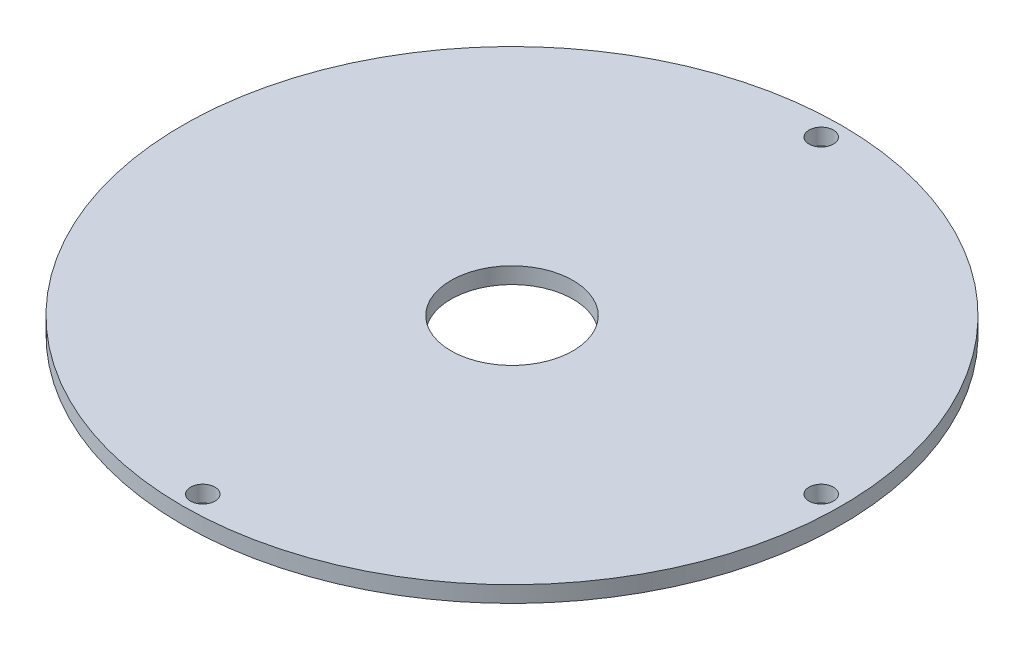
ISO-10303-21;
HEADER;
FILE_DESCRIPTION(('STEP AP214'),'2;1');
FILE_NAME('part.step','',(''),(''),'','','');
FILE_SCHEMA(('AUTOMOTIVE_DESIGN { 1 0 10303 214 1 1 1 1 }'));
ENDSEC;
DATA;
#1=APPLICATION_CONTEXT('core data for automotive mechanical design processes');
#2=APPLICATION_PROTOCOL_DEFINITION('international standard','automotive_design',2000,#1);
#3=PRODUCT_CONTEXT('',#1,'mechanical');
#4=PRODUCT('Part','Part','',(#3));
#5=PRODUCT_RELATED_PRODUCT_CATEGORY('part','',(#4));
#6=PRODUCT_DEFINITION_FORMATION('','',#4);
#7=PRODUCT_DEFINITION_CONTEXT('part definition',#1,'design');
#8=PRODUCT_DEFINITION('design','',#6,#7);
#9=PRODUCT_DEFINITION_SHAPE('','',#8);
#10=(LENGTH_UNIT() NAMED_UNIT(*) SI_UNIT(.MILLI.,.METRE.));
#11=(NAMED_UNIT(*) PLANE_ANGLE_UNIT() SI_UNIT($,.RADIAN.));
#12=(NAMED_UNIT(*) SI_UNIT($,.STERADIAN.) SOLID_ANGLE_UNIT());
#13=UNCERTAINTY_MEASURE_WITH_UNIT(LENGTH_MEASURE(1.E-05),#10,'distance_accuracy_value','');
#14=(GEOMETRIC_REPRESENTATION_CONTEXT(3) GLOBAL_UNCERTAINTY_ASSIGNED_CONTEXT((#13)) GLOBAL_UNIT_ASSIGNED_CONTEXT((#10,
#11,#12)) REPRESENTATION_CONTEXT('',''));
#15=CARTESIAN_POINT('',(0.,0.,0.));
#16=DIRECTION('',(0.,0.,1.));
#17=DIRECTION('',(1.,0.,0.));
#18=AXIS2_PLACEMENT_3D('',#15,#16,#17);
#19=CARTESIAN_POINT('',(0.,2.,0.));
#20=DIRECTION('',(0.,-1.,0.));
#21=DIRECTION('',(0.,0.,-1.));
#22=AXIS2_PLACEMENT_3D('',#19,#20,#21);
#23=CYLINDRICAL_SURFACE('',#22,40.5);
#24=CARTESIAN_POINT('',(0.,2.,0.));
#25=DIRECTION('',(0.,1.,0.));
#26=DIRECTION('',(0.,0.,1.));
#27=AXIS2_PLACEMENT_3D('',#24,#25,#26);
#28=CIRCLE('',#27,40.5);
#29=CARTESIAN_POINT('',(0.,2.,40.5));
#30=VERTEX_POINT('',#29);
#31=EDGE_CURVE('E10',#30,#30,#28,.T.);
#32=ORIENTED_EDGE('',*,*,#31,.F.);
#33=EDGE_LOOP('',(#32));
#34=FACE_BOUND('',#33,.T.);
#35=CARTESIAN_POINT('',(0.,0.,0.));
#36=DIRECTION('',(0.,1.,0.));
#37=DIRECTION('',(0.,0.,1.));
#38=AXIS2_PLACEMENT_3D('',#35,#36,#37);
#39=CIRCLE('',#38,40.5);
#40=CARTESIAN_POINT('',(0.,0.,40.5));
#41=VERTEX_POINT('',#40);
#42=EDGE_CURVE('E35',#41,#41,#39,.T.);
#43=ORIENTED_EDGE('',*,*,#42,.T.);
#44=EDGE_LOOP('',(#43));
#45=FACE_BOUND('',#44,.T.);
#46=ADVANCED_FACE('F32',(#34,#45),#23,.T.);
#47=CARTESIAN_POINT('',(0.,2.,0.));
#48=DIRECTION('',(0.,1.,0.));
#49=DIRECTION('',(0.,0.,1.));
#50=AXIS2_PLACEMENT_3D('',#47,#48,#49);
#51=PLANE('',#50);
#52=CARTESIAN_POINT('',(0.,2.,0.));
#53=DIRECTION('',(0.,1.,0.));
#54=DIRECTION('',(0.,0.,1.));
#55=AXIS2_PLACEMENT_3D('',#52,#53,#54);
#56=CIRCLE('',#55,7.5);
#57=CARTESIAN_POINT('',(0.,2.,7.5));
#58=VERTEX_POINT('',#57);
#59=EDGE_CURVE('E62',#58,#58,#56,.T.);
#60=ORIENTED_EDGE('',*,*,#59,.F.);
#61=EDGE_LOOP('',(#60));
#62=FACE_BOUND('',#61,.T.);
#63=CARTESIAN_POINT('',(0.,2.,-38.));
#64=DIRECTION('',(0.,1.,0.));
#65=DIRECTION('',(0.,0.,1.));
#66=AXIS2_PLACEMENT_3D('',#63,#64,#65);
#67=CIRCLE('',#66,1.5);
#68=CARTESIAN_POINT('',(0.,2.,-36.5));
#69=VERTEX_POINT('',#68);
#70=EDGE_CURVE('E57',#69,#69,#67,.T.);
#71=ORIENTED_EDGE('',*,*,#70,.F.);
#72=EDGE_LOOP('',(#71));
#73=FACE_BOUND('',#72,.T.);
#74=CARTESIAN_POINT('',(38.,2.,0.));
#75=DIRECTION('',(0.,1.,0.));
#76=DIRECTION('',(0.,0.,1.));
#77=AXIS2_PLACEMENT_3D('',#74,#75,#76);
#78=CIRCLE('',#77,1.5);
#79=CARTESIAN_POINT('',(38.,2.,1.5));
#80=VERTEX_POINT('',#79);
#81=EDGE_CURVE('E51',#80,#80,#78,.T.);
#82=ORIENTED_EDGE('',*,*,#81,.F.);
#83=EDGE_LOOP('',(#82));
#84=FACE_BOUND('',#83,.T.);
#85=CARTESIAN_POINT('',(0.,2.,38.));
#86=DIRECTION('',(0.,1.,0.));
#87=DIRECTION('',(0.,0.,1.));
#88=AXIS2_PLACEMENT_3D('',#85,#86,#87);
#89=CIRCLE('',#88,1.5);
#90=CARTESIAN_POINT('',(0.,2.,39.5));
#91=VERTEX_POINT('',#90);
#92=EDGE_CURVE('E44',#91,#91,#89,.T.);
#93=ORIENTED_EDGE('',*,*,#92,.F.);
#94=EDGE_LOOP('',(#93));
#95=FACE_BOUND('',#94,.T.);
#96=ORIENTED_EDGE('',*,*,#31,.T.);
#97=EDGE_LOOP('',(#96));
#98=FACE_BOUND('',#97,.T.);
#99=ADVANCED_FACE('F78',(#62,#73,#84,#95,#98),#51,.T.);
#100=CARTESIAN_POINT('',(0.,0.,0.));
#101=DIRECTION('',(0.,1.,0.));
#102=DIRECTION('',(0.,0.,1.));
#103=AXIS2_PLACEMENT_3D('',#100,#101,#102);
#104=PLANE('',#103);
#105=CARTESIAN_POINT('',(0.,0.,0.));
#106=DIRECTION('',(0.,1.,0.));
#107=DIRECTION('',(0.,0.,1.));
#108=AXIS2_PLACEMENT_3D('',#105,#106,#107);
#109=CIRCLE('',#108,7.5);
#110=CARTESIAN_POINT('',(0.,0.,7.5));
#111=VERTEX_POINT('',#110);
#112=EDGE_CURVE('E48',#111,#111,#109,.T.);
#113=ORIENTED_EDGE('',*,*,#112,.T.);
#114=EDGE_LOOP('',(#113));
#115=FACE_BOUND('',#114,.T.);
#116=CARTESIAN_POINT('',(0.,0.,-38.));
#117=DIRECTION('',(0.,1.,0.));
#118=DIRECTION('',(0.,0.,1.));
#119=AXIS2_PLACEMENT_3D('',#116,#117,#118);
#120=CIRCLE('',#119,1.5);
#121=CARTESIAN_POINT('',(0.,0.,-36.5));
#122=VERTEX_POINT('',#121);
#123=EDGE_CURVE('E42',#122,#122,#120,.T.);
#124=ORIENTED_EDGE('',*,*,#123,.T.);
#125=EDGE_LOOP('',(#124));
#126=FACE_BOUND('',#125,.T.);
#127=CARTESIAN_POINT('',(38.,0.,0.));
#128=DIRECTION('',(0.,1.,0.));
#129=DIRECTION('',(0.,0.,1.));
#130=AXIS2_PLACEMENT_3D('',#127,#128,#129);
#131=CIRCLE('',#130,1.5);
#132=CARTESIAN_POINT('',(38.,0.,1.5));
#133=VERTEX_POINT('',#132);
#134=EDGE_CURVE('E54',#133,#133,#131,.T.);
#135=ORIENTED_EDGE('',*,*,#134,.T.);
#136=EDGE_LOOP('',(#135));
#137=FACE_BOUND('',#136,.T.);
#138=CARTESIAN_POINT('',(0.,0.,38.));
#139=DIRECTION('',(0.,1.,0.));
#140=DIRECTION('',(0.,0.,1.));
#141=AXIS2_PLACEMENT_3D('',#138,#139,#140);
#142=CIRCLE('',#141,1.5);
#143=CARTESIAN_POINT('',(0.,0.,39.5));
#144=VERTEX_POINT('',#143);
#145=EDGE_CURVE('E47',#144,#144,#142,.T.);
#146=ORIENTED_EDGE('',*,*,#145,.T.);
#147=EDGE_LOOP('',(#146));
#148=FACE_BOUND('',#147,.T.);
#149=ORIENTED_EDGE('',*,*,#42,.F.);
#150=EDGE_LOOP('',(#149));
#151=FACE_BOUND('',#150,.T.);
#152=ADVANCED_FACE('F68',(#115,#126,#137,#148,#151),#104,.F.);
#153=CARTESIAN_POINT('',(0.,0.,38.));
#154=DIRECTION('',(0.,1.,0.));
#155=DIRECTION('',(0.,0.,1.));
#156=AXIS2_PLACEMENT_3D('',#153,#154,#155);
#157=CYLINDRICAL_SURFACE('',#156,1.5);
#158=ORIENTED_EDGE('',*,*,#145,.F.);
#159=EDGE_LOOP('',(#158));
#160=FACE_BOUND('',#159,.T.);
#161=ORIENTED_EDGE('',*,*,#92,.T.);
#162=EDGE_LOOP('',(#161));
#163=FACE_BOUND('',#162,.T.);
#164=ADVANCED_FACE('F88',(#160,#163),#157,.F.);
#165=CARTESIAN_POINT('',(38.,0.,0.));
#166=DIRECTION('',(0.,1.,0.));
#167=DIRECTION('',(0.,0.,1.));
#168=AXIS2_PLACEMENT_3D('',#165,#166,#167);
#169=CYLINDRICAL_SURFACE('',#168,1.5);
#170=ORIENTED_EDGE('',*,*,#134,.F.);
#171=EDGE_LOOP('',(#170));
#172=FACE_BOUND('',#171,.T.);
#173=ORIENTED_EDGE('',*,*,#81,.T.);
#174=EDGE_LOOP('',(#173));
#175=FACE_BOUND('',#174,.T.);
#176=ADVANCED_FACE('F90',(#172,#175),#169,.F.);
#177=CARTESIAN_POINT('',(0.,0.,-38.));
#178=DIRECTION('',(0.,1.,0.));
#179=DIRECTION('',(0.,0.,1.));
#180=AXIS2_PLACEMENT_3D('',#177,#178,#179);
#181=CYLINDRICAL_SURFACE('',#180,1.5);
#182=ORIENTED_EDGE('',*,*,#123,.F.);
#183=EDGE_LOOP('',(#182));
#184=FACE_BOUND('',#183,.T.);
#185=ORIENTED_EDGE('',*,*,#70,.T.);
#186=EDGE_LOOP('',(#185));
#187=FACE_BOUND('',#186,.T.);
#188=ADVANCED_FACE('F74',(#184,#187),#181,.F.);
#189=CARTESIAN_POINT('',(0.,0.,0.));
#190=DIRECTION('',(0.,1.,0.));
#191=DIRECTION('',(0.,0.,1.));
#192=AXIS2_PLACEMENT_3D('',#189,#190,#191);
#193=CYLINDRICAL_SURFACE('',#192,7.5);
#194=ORIENTED_EDGE('',*,*,#112,.F.);
#195=EDGE_LOOP('',(#194));
#196=FACE_BOUND('',#195,.T.);
#197=ORIENTED_EDGE('',*,*,#59,.T.);
#198=EDGE_LOOP('',(#197));
#199=FACE_BOUND('',#198,.T.);
#200=ADVANCED_FACE('F71',(#196,#199),#193,.F.);
#201=CLOSED_SHELL('',(#46,#99,#152,#164,#176,#188,#200));
#202=MANIFOLD_SOLID_BREP('B2',#201);
#203=ADVANCED_BREP_SHAPE_REPRESENTATION('',(#18,#202),#14);
#204=SHAPE_DEFINITION_REPRESENTATION(#9,#203);
ENDSEC;
END-ISO-10303-21;
